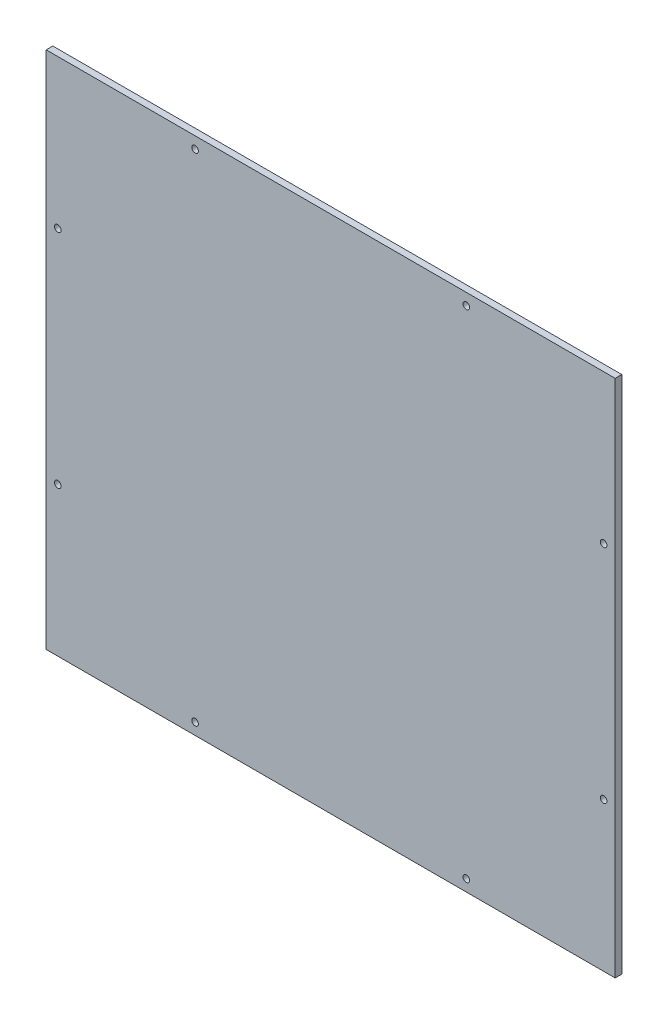
ISO-10303-21;
HEADER;
FILE_DESCRIPTION(('STEP AP214'),'2;1');
FILE_NAME('part.step','',(''),(''),'','','');
FILE_SCHEMA(('AUTOMOTIVE_DESIGN { 1 0 10303 214 1 1 1 1 }'));
ENDSEC;
DATA;
#1=APPLICATION_CONTEXT('core data for automotive mechanical design processes');
#2=APPLICATION_PROTOCOL_DEFINITION('international standard','automotive_design',2000,#1);
#3=PRODUCT_CONTEXT('',#1,'mechanical');
#4=PRODUCT('Part','Part','',(#3));
#5=PRODUCT_RELATED_PRODUCT_CATEGORY('part','',(#4));
#6=PRODUCT_DEFINITION_FORMATION('','',#4);
#7=PRODUCT_DEFINITION_CONTEXT('part definition',#1,'design');
#8=PRODUCT_DEFINITION('design','',#6,#7);
#9=PRODUCT_DEFINITION_SHAPE('','',#8);
#10=(LENGTH_UNIT() NAMED_UNIT(*) SI_UNIT(.MILLI.,.METRE.));
#11=(NAMED_UNIT(*) PLANE_ANGLE_UNIT() SI_UNIT($,.RADIAN.));
#12=(NAMED_UNIT(*) SI_UNIT($,.STERADIAN.) SOLID_ANGLE_UNIT());
#13=UNCERTAINTY_MEASURE_WITH_UNIT(LENGTH_MEASURE(1.E-05),#10,'distance_accuracy_value','');
#14=(GEOMETRIC_REPRESENTATION_CONTEXT(3) GLOBAL_UNCERTAINTY_ASSIGNED_CONTEXT((#13)) GLOBAL_UNIT_ASSIGNED_CONTEXT((#10,
#11,#12)) REPRESENTATION_CONTEXT('',''));
#15=CARTESIAN_POINT('',(0.,0.,0.));
#16=DIRECTION('',(0.,0.,1.));
#17=DIRECTION('',(1.,0.,0.));
#18=AXIS2_PLACEMENT_3D('',#15,#16,#17);
#19=CARTESIAN_POINT('',(0.,0.,4.));
#20=DIRECTION('',(0.,0.,1.));
#21=DIRECTION('',(1.,0.,0.));
#22=AXIS2_PLACEMENT_3D('',#19,#20,#21);
#23=PLANE('',#22);
#24=CARTESIAN_POINT('',(-7.00000000000001,90.0000000000001,4.));
#25=DIRECTION('',(0.,0.,1.));
#26=DIRECTION('',(-1.,0.,0.));
#27=AXIS2_PLACEMENT_3D('',#24,#25,#26);
#28=CIRCLE('',#27,2.);
#29=CARTESIAN_POINT('',(-9.00000000000001,90.0000000000001,4.));
#30=VERTEX_POINT('',#29);
#31=EDGE_CURVE('E147',#30,#30,#28,.T.);
#32=ORIENTED_EDGE('',*,*,#31,.F.);
#33=EDGE_LOOP('',(#32));
#34=FACE_BOUND('',#33,.T.);
#35=CARTESIAN_POINT('',(-254.,7.00000000000004,4.));
#36=DIRECTION('',(0.,0.,1.));
#37=DIRECTION('',(-1.,0.,0.));
#38=AXIS2_PLACEMENT_3D('',#35,#36,#37);
#39=CIRCLE('',#38,2.);
#40=CARTESIAN_POINT('',(-256.,7.00000000000004,4.));
#41=VERTEX_POINT('',#40);
#42=EDGE_CURVE('E135',#41,#41,#39,.T.);
#43=ORIENTED_EDGE('',*,*,#42,.F.);
#44=EDGE_LOOP('',(#43));
#45=FACE_BOUND('',#44,.T.);
#46=CARTESIAN_POINT('',(-7.,224.,4.));
#47=DIRECTION('',(0.,0.,1.));
#48=DIRECTION('',(1.,0.,0.));
#49=AXIS2_PLACEMENT_3D('',#46,#47,#48);
#50=CIRCLE('',#49,2.);
#51=CARTESIAN_POINT('',(-5.,224.,4.));
#52=VERTEX_POINT('',#51);
#53=EDGE_CURVE('E123',#52,#52,#50,.T.);
#54=ORIENTED_EDGE('',*,*,#53,.F.);
#55=EDGE_LOOP('',(#54));
#56=FACE_BOUND('',#55,.T.);
#57=CARTESIAN_POINT('',(-90.0000000000001,307.,4.));
#58=DIRECTION('',(0.,0.,1.));
#59=DIRECTION('',(-1.,0.,0.));
#60=AXIS2_PLACEMENT_3D('',#57,#58,#59);
#61=CIRCLE('',#60,2.);
#62=CARTESIAN_POINT('',(-92.0000000000001,307.,4.));
#63=VERTEX_POINT('',#62);
#64=EDGE_CURVE('E102',#63,#63,#61,.T.);
#65=ORIENTED_EDGE('',*,*,#64,.F.);
#66=EDGE_LOOP('',(#65));
#67=FACE_BOUND('',#66,.T.);
#68=DIRECTION('',(0.,1.,0.));
#69=VECTOR('',#68,1.);
#70=CARTESIAN_POINT('',(0.,0.,4.));
#71=LINE('',#70,#69);
#72=CARTESIAN_POINT('',(0.,0.,4.));
#73=VERTEX_POINT('',#72);
#74=CARTESIAN_POINT('',(0.,314.,4.));
#75=VERTEX_POINT('',#74);
#76=EDGE_CURVE('E87',#73,#75,#71,.T.);
#77=ORIENTED_EDGE('',*,*,#76,.T.);
#78=DIRECTION('',(-1.,0.,0.));
#79=VECTOR('',#78,1.);
#80=CARTESIAN_POINT('',(0.,314.,4.));
#81=LINE('',#80,#79);
#82=CARTESIAN_POINT('',(-344.,314.,4.));
#83=VERTEX_POINT('',#82);
#84=EDGE_CURVE('E82',#75,#83,#81,.T.);
#85=ORIENTED_EDGE('',*,*,#84,.T.);
#86=DIRECTION('',(0.,-1.,0.));
#87=VECTOR('',#86,1.);
#88=CARTESIAN_POINT('',(-344.,0.,4.));
#89=LINE('',#88,#87);
#90=CARTESIAN_POINT('',(-344.,0.,4.));
#91=VERTEX_POINT('',#90);
#92=EDGE_CURVE('E85',#83,#91,#89,.T.);
#93=ORIENTED_EDGE('',*,*,#92,.T.);
#94=DIRECTION('',(1.,0.,0.));
#95=VECTOR('',#94,1.);
#96=CARTESIAN_POINT('',(0.,0.,4.));
#97=LINE('',#96,#95);
#98=EDGE_CURVE('E52',#91,#73,#97,.T.);
#99=ORIENTED_EDGE('',*,*,#98,.T.);
#100=EDGE_LOOP('',(#77,#85,#93,#99));
#101=FACE_BOUND('',#100,.T.);
#102=CARTESIAN_POINT('',(-254.,307.,4.));
#103=DIRECTION('',(0.,0.,1.));
#104=DIRECTION('',(1.,0.,0.));
#105=AXIS2_PLACEMENT_3D('',#102,#103,#104);
#106=CIRCLE('',#105,2.);
#107=CARTESIAN_POINT('',(-252.,307.,4.));
#108=VERTEX_POINT('',#107);
#109=EDGE_CURVE('E117',#108,#108,#106,.T.);
#110=ORIENTED_EDGE('',*,*,#109,.F.);
#111=EDGE_LOOP('',(#110));
#112=FACE_BOUND('',#111,.T.);
#113=CARTESIAN_POINT('',(-337.,224.,4.));
#114=DIRECTION('',(0.,0.,1.));
#115=DIRECTION('',(-1.,0.,0.));
#116=AXIS2_PLACEMENT_3D('',#113,#114,#115);
#117=CIRCLE('',#116,2.);
#118=CARTESIAN_POINT('',(-339.,224.,4.));
#119=VERTEX_POINT('',#118);
#120=EDGE_CURVE('E129',#119,#119,#117,.T.);
#121=ORIENTED_EDGE('',*,*,#120,.F.);
#122=EDGE_LOOP('',(#121));
#123=FACE_BOUND('',#122,.T.);
#124=CARTESIAN_POINT('',(-337.,90.,4.));
#125=DIRECTION('',(0.,0.,1.));
#126=DIRECTION('',(1.,0.,0.));
#127=AXIS2_PLACEMENT_3D('',#124,#125,#126);
#128=CIRCLE('',#127,2.);
#129=CARTESIAN_POINT('',(-335.,90.,4.));
#130=VERTEX_POINT('',#129);
#131=EDGE_CURVE('E141',#130,#130,#128,.T.);
#132=ORIENTED_EDGE('',*,*,#131,.F.);
#133=EDGE_LOOP('',(#132));
#134=FACE_BOUND('',#133,.T.);
#135=CARTESIAN_POINT('',(-90.0000000000001,7.00000000000006,4.));
#136=DIRECTION('',(0.,0.,1.));
#137=DIRECTION('',(1.,0.,0.));
#138=AXIS2_PLACEMENT_3D('',#135,#136,#137);
#139=CIRCLE('',#138,2.);
#140=CARTESIAN_POINT('',(-88.0000000000001,7.00000000000006,4.));
#141=VERTEX_POINT('',#140);
#142=EDGE_CURVE('E153',#141,#141,#139,.T.);
#143=ORIENTED_EDGE('',*,*,#142,.F.);
#144=EDGE_LOOP('',(#143));
#145=FACE_BOUND('',#144,.T.);
#146=ADVANCED_FACE('F35',(#34,#45,#56,#67,#101,#112,#123,#134,#145),#23,.T.);
#147=CARTESIAN_POINT('',(0.,0.,0.));
#148=DIRECTION('',(0.,0.,1.));
#149=DIRECTION('',(1.,0.,0.));
#150=AXIS2_PLACEMENT_3D('',#147,#148,#149);
#151=PLANE('',#150);
#152=CARTESIAN_POINT('',(-7.00000000000001,90.0000000000001,0.));
#153=DIRECTION('',(0.,0.,1.));
#154=DIRECTION('',(-1.,0.,0.));
#155=AXIS2_PLACEMENT_3D('',#152,#153,#154);
#156=CIRCLE('',#155,2.);
#157=CARTESIAN_POINT('',(-9.00000000000001,90.0000000000001,0.));
#158=VERTEX_POINT('',#157);
#159=EDGE_CURVE('E150',#158,#158,#156,.T.);
#160=ORIENTED_EDGE('',*,*,#159,.T.);
#161=EDGE_LOOP('',(#160));
#162=FACE_BOUND('',#161,.T.);
#163=CARTESIAN_POINT('',(-254.,7.00000000000004,0.));
#164=DIRECTION('',(0.,0.,1.));
#165=DIRECTION('',(-1.,0.,0.));
#166=AXIS2_PLACEMENT_3D('',#163,#164,#165);
#167=CIRCLE('',#166,2.);
#168=CARTESIAN_POINT('',(-256.,7.00000000000004,0.));
#169=VERTEX_POINT('',#168);
#170=EDGE_CURVE('E138',#169,#169,#167,.T.);
#171=ORIENTED_EDGE('',*,*,#170,.T.);
#172=EDGE_LOOP('',(#171));
#173=FACE_BOUND('',#172,.T.);
#174=CARTESIAN_POINT('',(-7.,224.,0.));
#175=DIRECTION('',(0.,0.,1.));
#176=DIRECTION('',(1.,0.,0.));
#177=AXIS2_PLACEMENT_3D('',#174,#175,#176);
#178=CIRCLE('',#177,2.);
#179=CARTESIAN_POINT('',(-5.,224.,0.));
#180=VERTEX_POINT('',#179);
#181=EDGE_CURVE('E126',#180,#180,#178,.T.);
#182=ORIENTED_EDGE('',*,*,#181,.T.);
#183=EDGE_LOOP('',(#182));
#184=FACE_BOUND('',#183,.T.);
#185=CARTESIAN_POINT('',(-90.0000000000001,307.,0.));
#186=DIRECTION('',(0.,0.,1.));
#187=DIRECTION('',(-1.,0.,0.));
#188=AXIS2_PLACEMENT_3D('',#185,#186,#187);
#189=CIRCLE('',#188,2.);
#190=CARTESIAN_POINT('',(-92.0000000000001,307.,0.));
#191=VERTEX_POINT('',#190);
#192=EDGE_CURVE('E114',#191,#191,#189,.T.);
#193=ORIENTED_EDGE('',*,*,#192,.T.);
#194=EDGE_LOOP('',(#193));
#195=FACE_BOUND('',#194,.T.);
#196=DIRECTION('',(0.,1.,0.));
#197=VECTOR('',#196,1.);
#198=CARTESIAN_POINT('',(0.,0.,0.));
#199=LINE('',#198,#197);
#200=CARTESIAN_POINT('',(0.,0.,0.));
#201=VERTEX_POINT('',#200);
#202=CARTESIAN_POINT('',(0.,314.,0.));
#203=VERTEX_POINT('',#202);
#204=EDGE_CURVE('E99',#201,#203,#199,.T.);
#205=ORIENTED_EDGE('',*,*,#204,.F.);
#206=DIRECTION('',(1.,0.,0.));
#207=VECTOR('',#206,1.);
#208=CARTESIAN_POINT('',(0.,0.,0.));
#209=LINE('',#208,#207);
#210=CARTESIAN_POINT('',(-344.,0.,0.));
#211=VERTEX_POINT('',#210);
#212=EDGE_CURVE('E75',#211,#201,#209,.T.);
#213=ORIENTED_EDGE('',*,*,#212,.F.);
#214=DIRECTION('',(0.,-1.,0.));
#215=VECTOR('',#214,1.);
#216=CARTESIAN_POINT('',(-344.,0.,0.));
#217=LINE('',#216,#215);
#218=CARTESIAN_POINT('',(-344.,314.,0.));
#219=VERTEX_POINT('',#218);
#220=EDGE_CURVE('E69',#219,#211,#217,.T.);
#221=ORIENTED_EDGE('',*,*,#220,.F.);
#222=DIRECTION('',(-1.,0.,0.));
#223=VECTOR('',#222,1.);
#224=CARTESIAN_POINT('',(0.,314.,0.));
#225=LINE('',#224,#223);
#226=EDGE_CURVE('E91',#203,#219,#225,.T.);
#227=ORIENTED_EDGE('',*,*,#226,.F.);
#228=EDGE_LOOP('',(#205,#213,#221,#227));
#229=FACE_BOUND('',#228,.T.);
#230=CARTESIAN_POINT('',(-254.,307.,0.));
#231=DIRECTION('',(0.,0.,1.));
#232=DIRECTION('',(1.,0.,0.));
#233=AXIS2_PLACEMENT_3D('',#230,#231,#232);
#234=CIRCLE('',#233,2.);
#235=CARTESIAN_POINT('',(-252.,307.,0.));
#236=VERTEX_POINT('',#235);
#237=EDGE_CURVE('E120',#236,#236,#234,.T.);
#238=ORIENTED_EDGE('',*,*,#237,.T.);
#239=EDGE_LOOP('',(#238));
#240=FACE_BOUND('',#239,.T.);
#241=CARTESIAN_POINT('',(-337.,224.,0.));
#242=DIRECTION('',(0.,0.,1.));
#243=DIRECTION('',(-1.,0.,0.));
#244=AXIS2_PLACEMENT_3D('',#241,#242,#243);
#245=CIRCLE('',#244,2.);
#246=CARTESIAN_POINT('',(-339.,224.,0.));
#247=VERTEX_POINT('',#246);
#248=EDGE_CURVE('E132',#247,#247,#245,.T.);
#249=ORIENTED_EDGE('',*,*,#248,.T.);
#250=EDGE_LOOP('',(#249));
#251=FACE_BOUND('',#250,.T.);
#252=CARTESIAN_POINT('',(-337.,90.,0.));
#253=DIRECTION('',(0.,0.,1.));
#254=DIRECTION('',(1.,0.,0.));
#255=AXIS2_PLACEMENT_3D('',#252,#253,#254);
#256=CIRCLE('',#255,2.);
#257=CARTESIAN_POINT('',(-335.,90.,0.));
#258=VERTEX_POINT('',#257);
#259=EDGE_CURVE('E144',#258,#258,#256,.T.);
#260=ORIENTED_EDGE('',*,*,#259,.T.);
#261=EDGE_LOOP('',(#260));
#262=FACE_BOUND('',#261,.T.);
#263=CARTESIAN_POINT('',(-90.0000000000001,7.00000000000006,0.));
#264=DIRECTION('',(0.,0.,1.));
#265=DIRECTION('',(1.,0.,0.));
#266=AXIS2_PLACEMENT_3D('',#263,#264,#265);
#267=CIRCLE('',#266,2.);
#268=CARTESIAN_POINT('',(-88.0000000000001,7.00000000000006,0.));
#269=VERTEX_POINT('',#268);
#270=EDGE_CURVE('E156',#269,#269,#267,.T.);
#271=ORIENTED_EDGE('',*,*,#270,.T.);
#272=EDGE_LOOP('',(#271));
#273=FACE_BOUND('',#272,.T.);
#274=ADVANCED_FACE('F110',(#162,#173,#184,#195,#229,#240,#251,#262,#273),#151,.F.);
#275=CARTESIAN_POINT('',(0.,0.,4.));
#276=DIRECTION('',(-1.,0.,0.));
#277=DIRECTION('',(0.,0.,1.));
#278=AXIS2_PLACEMENT_3D('',#275,#276,#277);
#279=PLANE('',#278);
#280=ORIENTED_EDGE('',*,*,#204,.T.);
#281=DIRECTION('',(0.,0.,-1.));
#282=VECTOR('',#281,1.);
#283=CARTESIAN_POINT('',(0.,314.,4.));
#284=LINE('',#283,#282);
#285=EDGE_CURVE('E11',#75,#203,#284,.T.);
#286=ORIENTED_EDGE('',*,*,#285,.F.);
#287=ORIENTED_EDGE('',*,*,#76,.F.);
#288=DIRECTION('',(0.,0.,-1.));
#289=VECTOR('',#288,1.);
#290=CARTESIAN_POINT('',(0.,0.,4.));
#291=LINE('',#290,#289);
#292=EDGE_CURVE('E95',#73,#201,#291,.T.);
#293=ORIENTED_EDGE('',*,*,#292,.T.);
#294=EDGE_LOOP('',(#280,#286,#287,#293));
#295=FACE_BOUND('',#294,.T.);
#296=ADVANCED_FACE('F37',(#295),#279,.F.);
#297=CARTESIAN_POINT('',(0.,314.,4.));
#298=DIRECTION('',(0.,-1.,0.));
#299=DIRECTION('',(1.,0.,0.));
#300=AXIS2_PLACEMENT_3D('',#297,#298,#299);
#301=PLANE('',#300);
#302=ORIENTED_EDGE('',*,*,#226,.T.);
#303=DIRECTION('',(0.,0.,-1.));
#304=VECTOR('',#303,1.);
#305=CARTESIAN_POINT('',(-344.,314.,4.));
#306=LINE('',#305,#304);
#307=EDGE_CURVE('E44',#83,#219,#306,.T.);
#308=ORIENTED_EDGE('',*,*,#307,.F.);
#309=ORIENTED_EDGE('',*,*,#84,.F.);
#310=ORIENTED_EDGE('',*,*,#285,.T.);
#311=EDGE_LOOP('',(#302,#308,#309,#310));
#312=FACE_BOUND('',#311,.T.);
#313=ADVANCED_FACE('F90',(#312),#301,.F.);
#314=CARTESIAN_POINT('',(-344.,0.,4.));
#315=DIRECTION('',(1.,0.,0.));
#316=DIRECTION('',(0.,0.,-1.));
#317=AXIS2_PLACEMENT_3D('',#314,#315,#316);
#318=PLANE('',#317);
#319=ORIENTED_EDGE('',*,*,#220,.T.);
#320=DIRECTION('',(0.,0.,-1.));
#321=VECTOR('',#320,1.);
#322=CARTESIAN_POINT('',(-344.,0.,4.));
#323=LINE('',#322,#321);
#324=EDGE_CURVE('E92',#91,#211,#323,.T.);
#325=ORIENTED_EDGE('',*,*,#324,.F.);
#326=ORIENTED_EDGE('',*,*,#92,.F.);
#327=ORIENTED_EDGE('',*,*,#307,.T.);
#328=EDGE_LOOP('',(#319,#325,#326,#327));
#329=FACE_BOUND('',#328,.T.);
#330=ADVANCED_FACE('F93',(#329),#318,.F.);
#331=CARTESIAN_POINT('',(0.,0.,4.));
#332=DIRECTION('',(0.,1.,0.));
#333=DIRECTION('',(-1.,0.,0.));
#334=AXIS2_PLACEMENT_3D('',#331,#332,#333);
#335=PLANE('',#334);
#336=ORIENTED_EDGE('',*,*,#212,.T.);
#337=ORIENTED_EDGE('',*,*,#292,.F.);
#338=ORIENTED_EDGE('',*,*,#98,.F.);
#339=ORIENTED_EDGE('',*,*,#324,.T.);
#340=EDGE_LOOP('',(#336,#337,#338,#339));
#341=FACE_BOUND('',#340,.T.);
#342=ADVANCED_FACE('F107',(#341),#335,.F.);
#343=CARTESIAN_POINT('',(-90.0000000000001,307.,4.));
#344=DIRECTION('',(0.,0.,-1.));
#345=DIRECTION('',(-1.,0.,0.));
#346=AXIS2_PLACEMENT_3D('',#343,#344,#345);
#347=CYLINDRICAL_SURFACE('',#346,2.);
#348=ORIENTED_EDGE('',*,*,#64,.T.);
#349=EDGE_LOOP('',(#348));
#350=FACE_BOUND('',#349,.T.);
#351=ORIENTED_EDGE('',*,*,#192,.F.);
#352=EDGE_LOOP('',(#351));
#353=FACE_BOUND('',#352,.T.);
#354=ADVANCED_FACE('F176',(#350,#353),#347,.F.);
#355=CARTESIAN_POINT('',(-254.,307.,4.));
#356=DIRECTION('',(0.,0.,-1.));
#357=DIRECTION('',(-1.,0.,0.));
#358=AXIS2_PLACEMENT_3D('',#355,#356,#357);
#359=CYLINDRICAL_SURFACE('',#358,2.);
#360=ORIENTED_EDGE('',*,*,#109,.T.);
#361=EDGE_LOOP('',(#360));
#362=FACE_BOUND('',#361,.T.);
#363=ORIENTED_EDGE('',*,*,#237,.F.);
#364=EDGE_LOOP('',(#363));
#365=FACE_BOUND('',#364,.T.);
#366=ADVANCED_FACE('F224',(#362,#365),#359,.F.);
#367=CARTESIAN_POINT('',(-7.,224.,4.));
#368=DIRECTION('',(0.,0.,-1.));
#369=DIRECTION('',(-1.,0.,0.));
#370=AXIS2_PLACEMENT_3D('',#367,#368,#369);
#371=CYLINDRICAL_SURFACE('',#370,2.);
#372=ORIENTED_EDGE('',*,*,#53,.T.);
#373=EDGE_LOOP('',(#372));
#374=FACE_BOUND('',#373,.T.);
#375=ORIENTED_EDGE('',*,*,#181,.F.);
#376=EDGE_LOOP('',(#375));
#377=FACE_BOUND('',#376,.T.);
#378=ADVANCED_FACE('F232',(#374,#377),#371,.F.);
#379=CARTESIAN_POINT('',(-337.,224.,4.));
#380=DIRECTION('',(0.,0.,-1.));
#381=DIRECTION('',(-1.,0.,0.));
#382=AXIS2_PLACEMENT_3D('',#379,#380,#381);
#383=CYLINDRICAL_SURFACE('',#382,2.);
#384=ORIENTED_EDGE('',*,*,#120,.T.);
#385=EDGE_LOOP('',(#384));
#386=FACE_BOUND('',#385,.T.);
#387=ORIENTED_EDGE('',*,*,#248,.F.);
#388=EDGE_LOOP('',(#387));
#389=FACE_BOUND('',#388,.T.);
#390=ADVANCED_FACE('F240',(#386,#389),#383,.F.);
#391=CARTESIAN_POINT('',(-254.,7.00000000000004,4.));
#392=DIRECTION('',(0.,0.,-1.));
#393=DIRECTION('',(-1.,0.,0.));
#394=AXIS2_PLACEMENT_3D('',#391,#392,#393);
#395=CYLINDRICAL_SURFACE('',#394,2.);
#396=ORIENTED_EDGE('',*,*,#42,.T.);
#397=EDGE_LOOP('',(#396));
#398=FACE_BOUND('',#397,.T.);
#399=ORIENTED_EDGE('',*,*,#170,.F.);
#400=EDGE_LOOP('',(#399));
#401=FACE_BOUND('',#400,.T.);
#402=ADVANCED_FACE('F249',(#398,#401),#395,.F.);
#403=CARTESIAN_POINT('',(-337.,90.,4.));
#404=DIRECTION('',(0.,0.,-1.));
#405=DIRECTION('',(-1.,0.,0.));
#406=AXIS2_PLACEMENT_3D('',#403,#404,#405);
#407=CYLINDRICAL_SURFACE('',#406,2.);
#408=ORIENTED_EDGE('',*,*,#131,.T.);
#409=EDGE_LOOP('',(#408));
#410=FACE_BOUND('',#409,.T.);
#411=ORIENTED_EDGE('',*,*,#259,.F.);
#412=EDGE_LOOP('',(#411));
#413=FACE_BOUND('',#412,.T.);
#414=ADVANCED_FACE('F258',(#410,#413),#407,.F.);
#415=CARTESIAN_POINT('',(-7.00000000000001,90.0000000000001,4.));
#416=DIRECTION('',(0.,0.,-1.));
#417=DIRECTION('',(-1.,0.,0.));
#418=AXIS2_PLACEMENT_3D('',#415,#416,#417);
#419=CYLINDRICAL_SURFACE('',#418,2.);
#420=ORIENTED_EDGE('',*,*,#31,.T.);
#421=EDGE_LOOP('',(#420));
#422=FACE_BOUND('',#421,.T.);
#423=ORIENTED_EDGE('',*,*,#159,.F.);
#424=EDGE_LOOP('',(#423));
#425=FACE_BOUND('',#424,.T.);
#426=ADVANCED_FACE('F267',(#422,#425),#419,.F.);
#427=CARTESIAN_POINT('',(-90.0000000000001,7.00000000000006,4.));
#428=DIRECTION('',(0.,0.,-1.));
#429=DIRECTION('',(-1.,0.,0.));
#430=AXIS2_PLACEMENT_3D('',#427,#428,#429);
#431=CYLINDRICAL_SURFACE('',#430,2.);
#432=ORIENTED_EDGE('',*,*,#142,.T.);
#433=EDGE_LOOP('',(#432));
#434=FACE_BOUND('',#433,.T.);
#435=ORIENTED_EDGE('',*,*,#270,.F.);
#436=EDGE_LOOP('',(#435));
#437=FACE_BOUND('',#436,.T.);
#438=ADVANCED_FACE('F162',(#434,#437),#431,.F.);
#439=CLOSED_SHELL('',(#146,#274,#296,#313,#330,#342,#354,#366,#378,#390,#402,#414,#426,#438));
#440=MANIFOLD_SOLID_BREP('B2',#439);
#441=ADVANCED_BREP_SHAPE_REPRESENTATION('',(#18,#440),#14);
#442=SHAPE_DEFINITION_REPRESENTATION(#9,#441);
ENDSEC;
END-ISO-10303-21;
